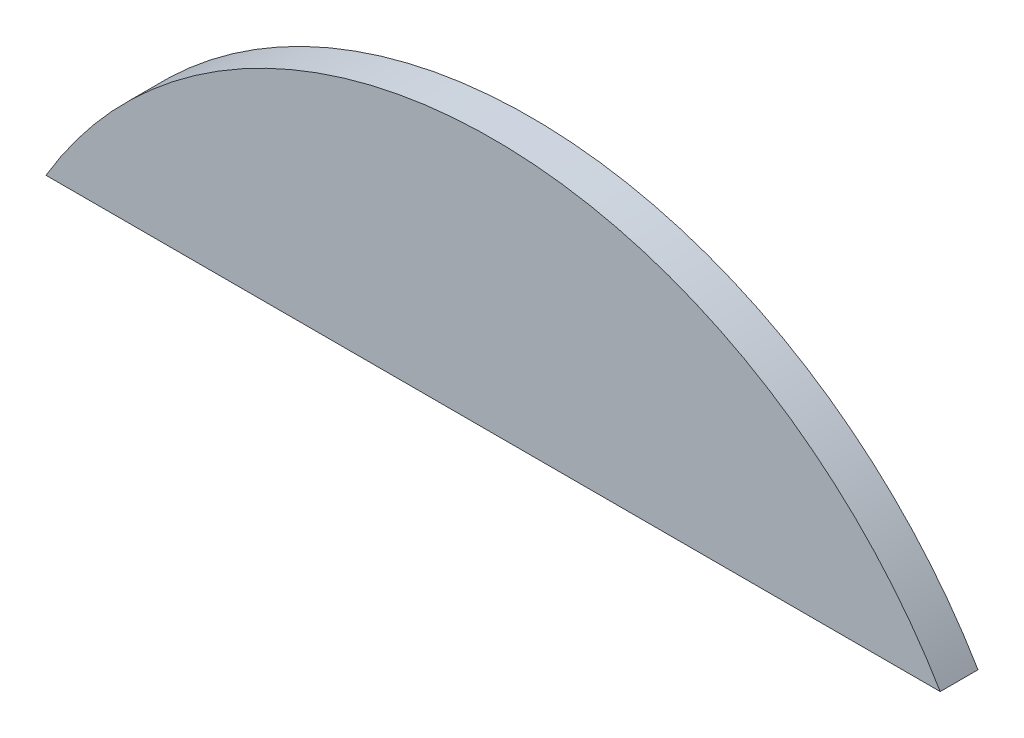
ISO-10303-21;
HEADER;
FILE_DESCRIPTION(('STEP AP214'),'2;1');
FILE_NAME('part.step','',(''),(''),'','','');
FILE_SCHEMA(('AUTOMOTIVE_DESIGN { 1 0 10303 214 1 1 1 1 }'));
ENDSEC;
DATA;
#1=APPLICATION_CONTEXT('core data for automotive mechanical design processes');
#2=APPLICATION_PROTOCOL_DEFINITION('international standard','automotive_design',2000,#1);
#3=PRODUCT_CONTEXT('',#1,'mechanical');
#4=PRODUCT('Part','Part','',(#3));
#5=PRODUCT_RELATED_PRODUCT_CATEGORY('part','',(#4));
#6=PRODUCT_DEFINITION_FORMATION('','',#4);
#7=PRODUCT_DEFINITION_CONTEXT('part definition',#1,'design');
#8=PRODUCT_DEFINITION('design','',#6,#7);
#9=PRODUCT_DEFINITION_SHAPE('','',#8);
#10=(LENGTH_UNIT() NAMED_UNIT(*) SI_UNIT(.MILLI.,.METRE.));
#11=(NAMED_UNIT(*) PLANE_ANGLE_UNIT() SI_UNIT($,.RADIAN.));
#12=(NAMED_UNIT(*) SI_UNIT($,.STERADIAN.) SOLID_ANGLE_UNIT());
#13=UNCERTAINTY_MEASURE_WITH_UNIT(LENGTH_MEASURE(1.E-05),#10,'distance_accuracy_value','');
#14=(GEOMETRIC_REPRESENTATION_CONTEXT(3) GLOBAL_UNCERTAINTY_ASSIGNED_CONTEXT((#13)) GLOBAL_UNIT_ASSIGNED_CONTEXT((#10,
#11,#12)) REPRESENTATION_CONTEXT('',''));
#15=CARTESIAN_POINT('',(0.,0.,0.));
#16=DIRECTION('',(0.,0.,1.));
#17=DIRECTION('',(1.,0.,0.));
#18=AXIS2_PLACEMENT_3D('',#15,#16,#17);
#19=CARTESIAN_POINT('',(0.,0.,2.));
#20=DIRECTION('',(0.,0.,-1.));
#21=DIRECTION('',(-1.,0.,0.));
#22=AXIS2_PLACEMENT_3D('',#19,#20,#21);
#23=CYLINDRICAL_SURFACE('',#22,27.5);
#24=CARTESIAN_POINT('',(0.,0.,0.));
#25=DIRECTION('',(0.,0.,1.));
#26=DIRECTION('',(-1.,0.,0.));
#27=AXIS2_PLACEMENT_3D('',#24,#25,#26);
#28=CIRCLE('',#27,27.5);
#29=CARTESIAN_POINT('',(23.6696007570892,14.,0.));
#30=VERTEX_POINT('',#29);
#31=CARTESIAN_POINT('',(-23.6696007570892,14.,0.));
#32=VERTEX_POINT('',#31);
#33=EDGE_CURVE('E70',#30,#32,#28,.T.);
#34=ORIENTED_EDGE('',*,*,#33,.T.);
#35=DIRECTION('',(0.,0.,-1.));
#36=VECTOR('',#35,1.);
#37=CARTESIAN_POINT('',(-23.6696007570892,14.,2.));
#38=LINE('',#37,#36);
#39=CARTESIAN_POINT('',(-23.6696007570892,14.,2.));
#40=VERTEX_POINT('',#39);
#41=EDGE_CURVE('E11',#40,#32,#38,.T.);
#42=ORIENTED_EDGE('',*,*,#41,.F.);
#43=CARTESIAN_POINT('',(0.,0.,2.));
#44=DIRECTION('',(0.,0.,1.));
#45=DIRECTION('',(-1.,0.,0.));
#46=AXIS2_PLACEMENT_3D('',#43,#44,#45);
#47=CIRCLE('',#46,27.5);
#48=CARTESIAN_POINT('',(23.6696007570892,14.,2.));
#49=VERTEX_POINT('',#48);
#50=EDGE_CURVE('E69',#49,#40,#47,.T.);
#51=ORIENTED_EDGE('',*,*,#50,.F.);
#52=DIRECTION('',(0.,0.,-1.));
#53=VECTOR('',#52,1.);
#54=CARTESIAN_POINT('',(23.6696007570892,14.,2.));
#55=LINE('',#54,#53);
#56=EDGE_CURVE('E47',#49,#30,#55,.T.);
#57=ORIENTED_EDGE('',*,*,#56,.T.);
#58=EDGE_LOOP('',(#34,#42,#51,#57));
#59=FACE_BOUND('',#58,.T.);
#60=ADVANCED_FACE('F39',(#59),#23,.T.);
#61=CARTESIAN_POINT('',(-23.6696007570892,14.,2.));
#62=DIRECTION('',(0.,1.,0.));
#63=DIRECTION('',(0.,0.,1.));
#64=AXIS2_PLACEMENT_3D('',#61,#62,#63);
#65=PLANE('',#64);
#66=DIRECTION('',(1.,0.,0.));
#67=VECTOR('',#66,1.);
#68=CARTESIAN_POINT('',(-23.6696007570892,14.,0.));
#69=LINE('',#68,#67);
#70=EDGE_CURVE('E62',#32,#30,#69,.T.);
#71=ORIENTED_EDGE('',*,*,#70,.T.);
#72=ORIENTED_EDGE('',*,*,#56,.F.);
#73=DIRECTION('',(1.,0.,0.));
#74=VECTOR('',#73,1.);
#75=CARTESIAN_POINT('',(-23.6696007570892,14.,2.));
#76=LINE('',#75,#74);
#77=EDGE_CURVE('E54',#40,#49,#76,.T.);
#78=ORIENTED_EDGE('',*,*,#77,.F.);
#79=ORIENTED_EDGE('',*,*,#41,.T.);
#80=EDGE_LOOP('',(#71,#72,#78,#79));
#81=FACE_BOUND('',#80,.T.);
#82=ADVANCED_FACE('F65',(#81),#65,.F.);
#83=CARTESIAN_POINT('',(0.,0.,2.));
#84=DIRECTION('',(0.,0.,-1.));
#85=DIRECTION('',(-1.,0.,0.));
#86=AXIS2_PLACEMENT_3D('',#83,#84,#85);
#87=PLANE('',#86);
#88=ORIENTED_EDGE('',*,*,#50,.T.);
#89=ORIENTED_EDGE('',*,*,#77,.T.);
#90=EDGE_LOOP('',(#88,#89));
#91=FACE_BOUND('',#90,.T.);
#92=ADVANCED_FACE('F77',(#91),#87,.F.);
#93=CARTESIAN_POINT('',(0.,0.,0.));
#94=DIRECTION('',(0.,0.,-1.));
#95=DIRECTION('',(-1.,0.,0.));
#96=AXIS2_PLACEMENT_3D('',#93,#94,#95);
#97=PLANE('',#96);
#98=ORIENTED_EDGE('',*,*,#33,.F.);
#99=ORIENTED_EDGE('',*,*,#70,.F.);
#100=EDGE_LOOP('',(#98,#99));
#101=FACE_BOUND('',#100,.T.);
#102=ADVANCED_FACE('F73',(#101),#97,.T.);
#103=CLOSED_SHELL('',(#60,#82,#92,#102));
#104=MANIFOLD_SOLID_BREP('B2',#103);
#105=ADVANCED_BREP_SHAPE_REPRESENTATION('',(#18,#104),#14);
#106=SHAPE_DEFINITION_REPRESENTATION(#9,#105);
ENDSEC;
END-ISO-10303-21;
